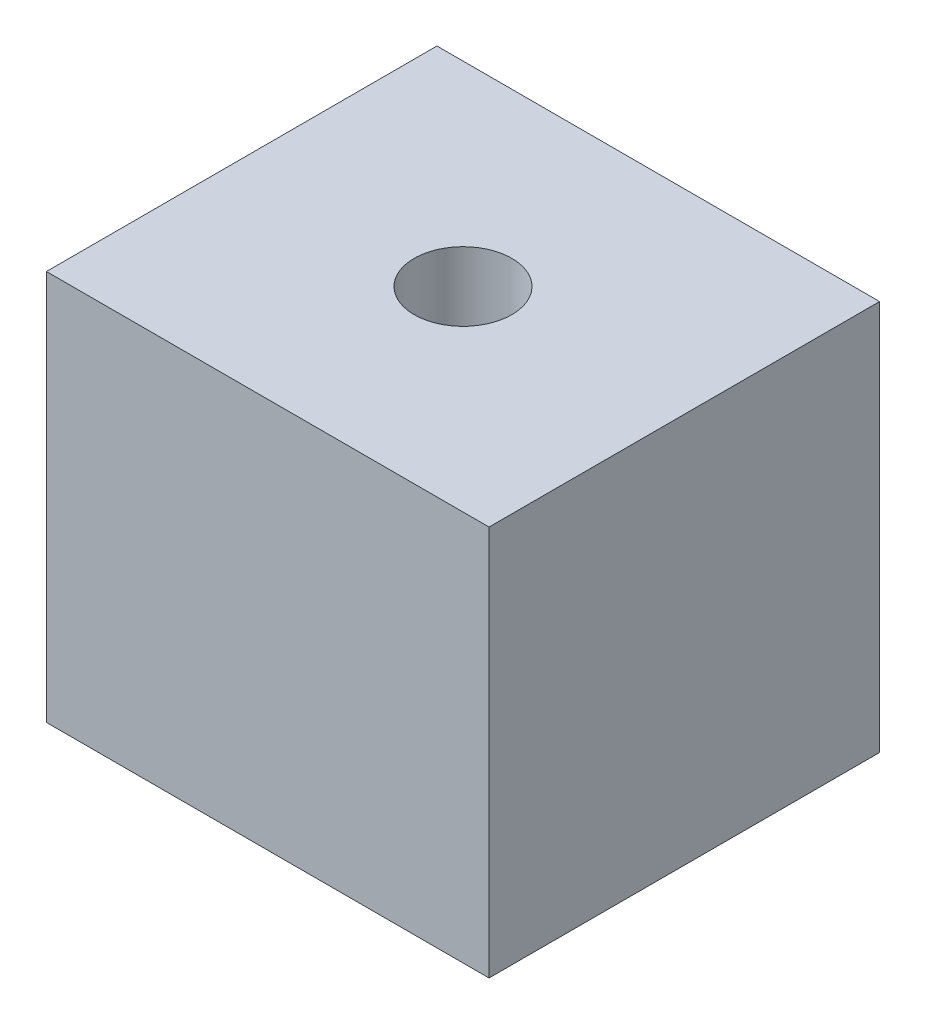
ISO-10303-21;
HEADER;
FILE_DESCRIPTION(('STEP AP214'),'2;1');
FILE_NAME('part.step','',(''),(''),'','','');
FILE_SCHEMA(('AUTOMOTIVE_DESIGN { 1 0 10303 214 1 1 1 1 }'));
ENDSEC;
DATA;
#1=APPLICATION_CONTEXT('core data for automotive mechanical design processes');
#2=APPLICATION_PROTOCOL_DEFINITION('international standard','automotive_design',2000,#1);
#3=PRODUCT_CONTEXT('',#1,'mechanical');
#4=PRODUCT('Part','Part','',(#3));
#5=PRODUCT_RELATED_PRODUCT_CATEGORY('part','',(#4));
#6=PRODUCT_DEFINITION_FORMATION('','',#4);
#7=PRODUCT_DEFINITION_CONTEXT('part definition',#1,'design');
#8=PRODUCT_DEFINITION('design','',#6,#7);
#9=PRODUCT_DEFINITION_SHAPE('','',#8);
#10=(LENGTH_UNIT() NAMED_UNIT(*) SI_UNIT(.MILLI.,.METRE.));
#11=(NAMED_UNIT(*) PLANE_ANGLE_UNIT() SI_UNIT($,.RADIAN.));
#12=(NAMED_UNIT(*) SI_UNIT($,.STERADIAN.) SOLID_ANGLE_UNIT());
#13=UNCERTAINTY_MEASURE_WITH_UNIT(LENGTH_MEASURE(1.E-05),#10,'distance_accuracy_value','');
#14=(GEOMETRIC_REPRESENTATION_CONTEXT(3) GLOBAL_UNCERTAINTY_ASSIGNED_CONTEXT((#13)) GLOBAL_UNIT_ASSIGNED_CONTEXT((#10,
#11,#12)) REPRESENTATION_CONTEXT('',''));
#15=CARTESIAN_POINT('',(0.,0.,0.));
#16=DIRECTION('',(0.,0.,1.));
#17=DIRECTION('',(1.,0.,0.));
#18=AXIS2_PLACEMENT_3D('',#15,#16,#17);
#19=CARTESIAN_POINT('',(4.75,25.25,30.));
#20=DIRECTION('',(0.,0.,-1.));
#21=DIRECTION('',(-1.,0.,0.));
#22=AXIS2_PLACEMENT_3D('',#19,#20,#21);
#23=CYLINDRICAL_SURFACE('',#22,2.);
#24=CARTESIAN_POINT('',(4.75,25.25,0.));
#25=DIRECTION('',(0.,0.,1.));
#26=DIRECTION('',(1.,0.,0.));
#27=AXIS2_PLACEMENT_3D('',#24,#25,#26);
#28=CIRCLE('',#27,2.);
#29=CARTESIAN_POINT('',(6.75,25.25,0.));
#30=VERTEX_POINT('',#29);
#31=EDGE_CURVE('E104',#30,#30,#28,.T.);
#32=ORIENTED_EDGE('',*,*,#31,.F.);
#33=EDGE_LOOP('',(#32));
#34=FACE_BOUND('',#33,.T.);
#35=CARTESIAN_POINT('',(4.75,25.25,7.));
#36=DIRECTION('',(0.,0.,1.));
#37=DIRECTION('',(1.,0.,0.));
#38=AXIS2_PLACEMENT_3D('',#35,#36,#37);
#39=CIRCLE('',#38,2.);
#40=CARTESIAN_POINT('',(6.75,25.25,7.));
#41=VERTEX_POINT('',#40);
#42=EDGE_CURVE('E125',#41,#41,#39,.T.);
#43=ORIENTED_EDGE('',*,*,#42,.T.);
#44=EDGE_LOOP('',(#43));
#45=FACE_BOUND('',#44,.T.);
#46=ADVANCED_FACE('F37',(#34,#45),#23,.F.);
#47=CARTESIAN_POINT('',(29.25,25.25,30.));
#48=DIRECTION('',(0.,0.,-1.));
#49=DIRECTION('',(-1.,0.,0.));
#50=AXIS2_PLACEMENT_3D('',#47,#48,#49);
#51=CYLINDRICAL_SURFACE('',#50,2.);
#52=CARTESIAN_POINT('',(29.25,25.25,0.));
#53=DIRECTION('',(0.,0.,1.));
#54=DIRECTION('',(1.,0.,0.));
#55=AXIS2_PLACEMENT_3D('',#52,#53,#54);
#56=CIRCLE('',#55,2.);
#57=CARTESIAN_POINT('',(31.25,25.25,0.));
#58=VERTEX_POINT('',#57);
#59=EDGE_CURVE('E116',#58,#58,#56,.T.);
#60=ORIENTED_EDGE('',*,*,#59,.F.);
#61=EDGE_LOOP('',(#60));
#62=FACE_BOUND('',#61,.T.);
#63=CARTESIAN_POINT('',(29.25,25.25,7.));
#64=DIRECTION('',(0.,0.,1.));
#65=DIRECTION('',(1.,0.,0.));
#66=AXIS2_PLACEMENT_3D('',#63,#64,#65);
#67=CIRCLE('',#66,2.);
#68=CARTESIAN_POINT('',(31.25,25.25,7.));
#69=VERTEX_POINT('',#68);
#70=EDGE_CURVE('E128',#69,#69,#67,.T.);
#71=ORIENTED_EDGE('',*,*,#70,.T.);
#72=EDGE_LOOP('',(#71));
#73=FACE_BOUND('',#72,.T.);
#74=ADVANCED_FACE('F166',(#62,#73),#51,.F.);
#75=CARTESIAN_POINT('',(29.25,4.75,30.));
#76=DIRECTION('',(0.,0.,-1.));
#77=DIRECTION('',(-1.,0.,0.));
#78=AXIS2_PLACEMENT_3D('',#75,#76,#77);
#79=CYLINDRICAL_SURFACE('',#78,2.00000000000001);
#80=CARTESIAN_POINT('',(29.25,4.75,0.));
#81=DIRECTION('',(0.,0.,1.));
#82=DIRECTION('',(1.,0.,0.));
#83=AXIS2_PLACEMENT_3D('',#80,#81,#82);
#84=CIRCLE('',#83,2.00000000000001);
#85=CARTESIAN_POINT('',(31.25,4.75,0.));
#86=VERTEX_POINT('',#85);
#87=EDGE_CURVE('E119',#86,#86,#84,.T.);
#88=ORIENTED_EDGE('',*,*,#87,.F.);
#89=EDGE_LOOP('',(#88));
#90=FACE_BOUND('',#89,.T.);
#91=CARTESIAN_POINT('',(29.25,4.75,7.));
#92=DIRECTION('',(0.,0.,1.));
#93=DIRECTION('',(1.,0.,0.));
#94=AXIS2_PLACEMENT_3D('',#91,#92,#93);
#95=CIRCLE('',#94,2.00000000000001);
#96=CARTESIAN_POINT('',(31.25,4.75,7.));
#97=VERTEX_POINT('',#96);
#98=EDGE_CURVE('E131',#97,#97,#95,.T.);
#99=ORIENTED_EDGE('',*,*,#98,.T.);
#100=EDGE_LOOP('',(#99));
#101=FACE_BOUND('',#100,.T.);
#102=ADVANCED_FACE('F172',(#90,#101),#79,.F.);
#103=CARTESIAN_POINT('',(4.75,4.75,30.));
#104=DIRECTION('',(0.,0.,-1.));
#105=DIRECTION('',(-1.,0.,0.));
#106=AXIS2_PLACEMENT_3D('',#103,#104,#105);
#107=CYLINDRICAL_SURFACE('',#106,2.);
#108=CARTESIAN_POINT('',(4.75,4.75,0.));
#109=DIRECTION('',(0.,0.,1.));
#110=DIRECTION('',(1.,0.,0.));
#111=AXIS2_PLACEMENT_3D('',#108,#109,#110);
#112=CIRCLE('',#111,2.);
#113=CARTESIAN_POINT('',(6.75,4.75,0.));
#114=VERTEX_POINT('',#113);
#115=EDGE_CURVE('E122',#114,#114,#112,.T.);
#116=ORIENTED_EDGE('',*,*,#115,.F.);
#117=EDGE_LOOP('',(#116));
#118=FACE_BOUND('',#117,.T.);
#119=CARTESIAN_POINT('',(4.75,4.75,7.));
#120=DIRECTION('',(0.,0.,1.));
#121=DIRECTION('',(1.,0.,0.));
#122=AXIS2_PLACEMENT_3D('',#119,#120,#121);
#123=CIRCLE('',#122,2.);
#124=CARTESIAN_POINT('',(6.75,4.75,7.));
#125=VERTEX_POINT('',#124);
#126=EDGE_CURVE('E41',#125,#125,#123,.T.);
#127=ORIENTED_EDGE('',*,*,#126,.T.);
#128=EDGE_LOOP('',(#127));
#129=FACE_BOUND('',#128,.T.);
#130=ADVANCED_FACE('F144',(#118,#129),#107,.F.);
#131=CARTESIAN_POINT('',(0.,0.,30.));
#132=DIRECTION('',(0.,0.,-1.));
#133=DIRECTION('',(-1.,0.,0.));
#134=AXIS2_PLACEMENT_3D('',#131,#132,#133);
#135=PLANE('',#134);
#136=DIRECTION('',(0.,-1.,0.));
#137=VECTOR('',#136,1.);
#138=CARTESIAN_POINT('',(0.,0.,30.));
#139=LINE('',#138,#137);
#140=CARTESIAN_POINT('',(0.,30.,30.));
#141=VERTEX_POINT('',#140);
#142=CARTESIAN_POINT('',(0.,0.,30.));
#143=VERTEX_POINT('',#142);
#144=EDGE_CURVE('E87',#141,#143,#139,.T.);
#145=ORIENTED_EDGE('',*,*,#144,.T.);
#146=DIRECTION('',(1.,0.,0.));
#147=VECTOR('',#146,1.);
#148=CARTESIAN_POINT('',(0.,0.,30.));
#149=LINE('',#148,#147);
#150=CARTESIAN_POINT('',(34.,0.,30.));
#151=VERTEX_POINT('',#150);
#152=EDGE_CURVE('E83',#143,#151,#149,.T.);
#153=ORIENTED_EDGE('',*,*,#152,.T.);
#154=DIRECTION('',(0.,1.,0.));
#155=VECTOR('',#154,1.);
#156=CARTESIAN_POINT('',(34.,0.,30.));
#157=LINE('',#156,#155);
#158=CARTESIAN_POINT('',(34.,30.,30.));
#159=VERTEX_POINT('',#158);
#160=EDGE_CURVE('E86',#151,#159,#157,.T.);
#161=ORIENTED_EDGE('',*,*,#160,.T.);
#162=DIRECTION('',(-1.,0.,0.));
#163=VECTOR('',#162,1.);
#164=CARTESIAN_POINT('',(0.,30.,30.));
#165=LINE('',#164,#163);
#166=EDGE_CURVE('E55',#159,#141,#165,.T.);
#167=ORIENTED_EDGE('',*,*,#166,.T.);
#168=EDGE_LOOP('',(#145,#153,#161,#167));
#169=FACE_BOUND('',#168,.T.);
#170=ADVANCED_FACE('F84',(#169),#135,.F.);
#171=CARTESIAN_POINT('',(0.,0.,0.));
#172=DIRECTION('',(0.,0.,-1.));
#173=DIRECTION('',(-1.,0.,0.));
#174=AXIS2_PLACEMENT_3D('',#171,#172,#173);
#175=PLANE('',#174);
#176=ORIENTED_EDGE('',*,*,#87,.T.);
#177=EDGE_LOOP('',(#176));
#178=FACE_BOUND('',#177,.T.);
#179=ORIENTED_EDGE('',*,*,#31,.T.);
#180=EDGE_LOOP('',(#179));
#181=FACE_BOUND('',#180,.T.);
#182=DIRECTION('',(0.,-1.,0.));
#183=VECTOR('',#182,1.);
#184=CARTESIAN_POINT('',(0.,0.,0.));
#185=LINE('',#184,#183);
#186=CARTESIAN_POINT('',(0.,30.,0.));
#187=VERTEX_POINT('',#186);
#188=CARTESIAN_POINT('',(0.,0.,0.));
#189=VERTEX_POINT('',#188);
#190=EDGE_CURVE('E102',#187,#189,#185,.T.);
#191=ORIENTED_EDGE('',*,*,#190,.F.);
#192=DIRECTION('',(-1.,0.,0.));
#193=VECTOR('',#192,1.);
#194=CARTESIAN_POINT('',(0.,30.,0.));
#195=LINE('',#194,#193);
#196=CARTESIAN_POINT('',(34.,30.,0.));
#197=VERTEX_POINT('',#196);
#198=EDGE_CURVE('E108',#197,#187,#195,.T.);
#199=ORIENTED_EDGE('',*,*,#198,.F.);
#200=DIRECTION('',(0.,1.,0.));
#201=VECTOR('',#200,1.);
#202=CARTESIAN_POINT('',(34.,0.,0.));
#203=LINE('',#202,#201);
#204=CARTESIAN_POINT('',(34.,0.,0.));
#205=VERTEX_POINT('',#204);
#206=EDGE_CURVE('E106',#205,#197,#203,.T.);
#207=ORIENTED_EDGE('',*,*,#206,.F.);
#208=DIRECTION('',(1.,0.,0.));
#209=VECTOR('',#208,1.);
#210=CARTESIAN_POINT('',(0.,0.,0.));
#211=LINE('',#210,#209);
#212=EDGE_CURVE('E93',#189,#205,#211,.T.);
#213=ORIENTED_EDGE('',*,*,#212,.F.);
#214=EDGE_LOOP('',(#191,#199,#207,#213));
#215=FACE_BOUND('',#214,.T.);
#216=ORIENTED_EDGE('',*,*,#59,.T.);
#217=EDGE_LOOP('',(#216));
#218=FACE_BOUND('',#217,.T.);
#219=ORIENTED_EDGE('',*,*,#115,.T.);
#220=EDGE_LOOP('',(#219));
#221=FACE_BOUND('',#220,.T.);
#222=ADVANCED_FACE('F181',(#178,#181,#215,#218,#221),#175,.T.);
#223=CARTESIAN_POINT('',(0.,0.,30.));
#224=DIRECTION('',(1.,0.,0.));
#225=DIRECTION('',(0.,0.,-1.));
#226=AXIS2_PLACEMENT_3D('',#223,#224,#225);
#227=PLANE('',#226);
#228=DIRECTION('',(0.,0.,-1.));
#229=VECTOR('',#228,1.);
#230=CARTESIAN_POINT('',(0.,30.,30.));
#231=LINE('',#230,#229);
#232=EDGE_CURVE('E77',#141,#187,#231,.T.);
#233=ORIENTED_EDGE('',*,*,#232,.T.);
#234=ORIENTED_EDGE('',*,*,#190,.T.);
#235=DIRECTION('',(0.,0.,-1.));
#236=VECTOR('',#235,1.);
#237=CARTESIAN_POINT('',(0.,0.,30.));
#238=LINE('',#237,#236);
#239=EDGE_CURVE('E11',#143,#189,#238,.T.);
#240=ORIENTED_EDGE('',*,*,#239,.F.);
#241=ORIENTED_EDGE('',*,*,#144,.F.);
#242=EDGE_LOOP('',(#233,#234,#240,#241));
#243=FACE_BOUND('',#242,.T.);
#244=ADVANCED_FACE('F39',(#243),#227,.F.);
#245=CARTESIAN_POINT('',(0.,0.,30.));
#246=DIRECTION('',(0.,1.,0.));
#247=DIRECTION('',(0.,0.,1.));
#248=AXIS2_PLACEMENT_3D('',#245,#246,#247);
#249=PLANE('',#248);
#250=CARTESIAN_POINT('',(17.,0.,15.));
#251=DIRECTION('',(0.,1.,0.));
#252=DIRECTION('',(0.,0.,1.));
#253=AXIS2_PLACEMENT_3D('',#250,#251,#252);
#254=CIRCLE('',#253,3.75);
#255=CARTESIAN_POINT('',(17.,0.,18.75));
#256=VERTEX_POINT('',#255);
#257=EDGE_CURVE('E137',#256,#256,#254,.T.);
#258=ORIENTED_EDGE('',*,*,#257,.T.);
#259=EDGE_LOOP('',(#258));
#260=FACE_BOUND('',#259,.T.);
#261=ORIENTED_EDGE('',*,*,#239,.T.);
#262=ORIENTED_EDGE('',*,*,#212,.T.);
#263=DIRECTION('',(0.,0.,-1.));
#264=VECTOR('',#263,1.);
#265=CARTESIAN_POINT('',(34.,0.,30.));
#266=LINE('',#265,#264);
#267=EDGE_CURVE('E47',#151,#205,#266,.T.);
#268=ORIENTED_EDGE('',*,*,#267,.F.);
#269=ORIENTED_EDGE('',*,*,#152,.F.);
#270=EDGE_LOOP('',(#261,#262,#268,#269));
#271=FACE_BOUND('',#270,.T.);
#272=ADVANCED_FACE('F91',(#260,#271),#249,.F.);
#273=CARTESIAN_POINT('',(34.,0.,30.));
#274=DIRECTION('',(-1.,0.,0.));
#275=DIRECTION('',(0.,0.,1.));
#276=AXIS2_PLACEMENT_3D('',#273,#274,#275);
#277=PLANE('',#276);
#278=ORIENTED_EDGE('',*,*,#267,.T.);
#279=ORIENTED_EDGE('',*,*,#206,.T.);
#280=DIRECTION('',(0.,0.,-1.));
#281=VECTOR('',#280,1.);
#282=CARTESIAN_POINT('',(34.,30.,30.));
#283=LINE('',#282,#281);
#284=EDGE_CURVE('E70',#159,#197,#283,.T.);
#285=ORIENTED_EDGE('',*,*,#284,.F.);
#286=ORIENTED_EDGE('',*,*,#160,.F.);
#287=EDGE_LOOP('',(#278,#279,#285,#286));
#288=FACE_BOUND('',#287,.T.);
#289=ADVANCED_FACE('F97',(#288),#277,.F.);
#290=CARTESIAN_POINT('',(0.,30.,30.));
#291=DIRECTION('',(0.,-1.,0.));
#292=DIRECTION('',(0.,0.,-1.));
#293=AXIS2_PLACEMENT_3D('',#290,#291,#292);
#294=PLANE('',#293);
#295=CARTESIAN_POINT('',(17.,30.,15.));
#296=DIRECTION('',(0.,1.,0.));
#297=DIRECTION('',(0.,0.,1.));
#298=AXIS2_PLACEMENT_3D('',#295,#296,#297);
#299=CIRCLE('',#298,3.75);
#300=CARTESIAN_POINT('',(17.,30.,18.75));
#301=VERTEX_POINT('',#300);
#302=EDGE_CURVE('E134',#301,#301,#299,.T.);
#303=ORIENTED_EDGE('',*,*,#302,.F.);
#304=EDGE_LOOP('',(#303));
#305=FACE_BOUND('',#304,.T.);
#306=ORIENTED_EDGE('',*,*,#284,.T.);
#307=ORIENTED_EDGE('',*,*,#198,.T.);
#308=ORIENTED_EDGE('',*,*,#232,.F.);
#309=ORIENTED_EDGE('',*,*,#166,.F.);
#310=EDGE_LOOP('',(#306,#307,#308,#309));
#311=FACE_BOUND('',#310,.T.);
#312=ADVANCED_FACE('F149',(#305,#311),#294,.F.);
#313=CARTESIAN_POINT('',(0.,0.,7.));
#314=DIRECTION('',(0.,0.,1.));
#315=DIRECTION('',(1.,0.,0.));
#316=AXIS2_PLACEMENT_3D('',#313,#314,#315);
#317=PLANE('',#316);
#318=ORIENTED_EDGE('',*,*,#126,.F.);
#319=EDGE_LOOP('',(#318));
#320=FACE_BOUND('',#319,.T.);
#321=ADVANCED_FACE('F146',(#320),#317,.F.);
#322=ORIENTED_EDGE('',*,*,#98,.F.);
#323=EDGE_LOOP('',(#322));
#324=FACE_BOUND('',#323,.T.);
#325=ADVANCED_FACE('F148',(#324),#317,.F.);
#326=ORIENTED_EDGE('',*,*,#70,.F.);
#327=EDGE_LOOP('',(#326));
#328=FACE_BOUND('',#327,.T.);
#329=ADVANCED_FACE('F156',(#328),#317,.F.);
#330=ORIENTED_EDGE('',*,*,#42,.F.);
#331=EDGE_LOOP('',(#330));
#332=FACE_BOUND('',#331,.T.);
#333=ADVANCED_FACE('F151',(#332),#317,.F.);
#334=CARTESIAN_POINT('',(17.,0.,15.));
#335=DIRECTION('',(0.,1.,0.));
#336=DIRECTION('',(0.,0.,1.));
#337=AXIS2_PLACEMENT_3D('',#334,#335,#336);
#338=CYLINDRICAL_SURFACE('',#337,3.75);
#339=ORIENTED_EDGE('',*,*,#257,.F.);
#340=EDGE_LOOP('',(#339));
#341=FACE_BOUND('',#340,.T.);
#342=ORIENTED_EDGE('',*,*,#302,.T.);
#343=EDGE_LOOP('',(#342));
#344=FACE_BOUND('',#343,.T.);
#345=ADVANCED_FACE('F163',(#341,#344),#338,.F.);
#346=CLOSED_SHELL('',(#46,#74,#102,#130,#170,#222,#244,#272,#289,#312,#321,#325,#329,#333,#345));
#347=MANIFOLD_SOLID_BREP('B2',#346);
#348=ADVANCED_BREP_SHAPE_REPRESENTATION('',(#18,#347),#14);
#349=SHAPE_DEFINITION_REPRESENTATION(#9,#348);
ENDSEC;
END-ISO-10303-21;
